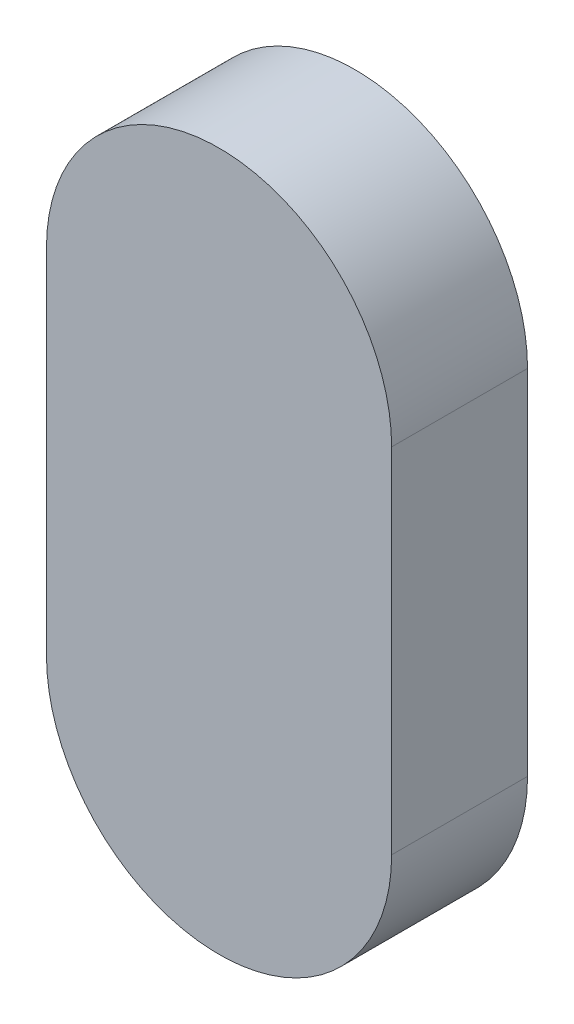
ISO-10303-21;
HEADER;
FILE_DESCRIPTION(('STEP AP214'),'2;1');
FILE_NAME('part.step','',(''),(''),'','','');
FILE_SCHEMA(('AUTOMOTIVE_DESIGN { 1 0 10303 214 1 1 1 1 }'));
ENDSEC;
DATA;
#1=APPLICATION_CONTEXT('core data for automotive mechanical design processes');
#2=APPLICATION_PROTOCOL_DEFINITION('international standard','automotive_design',2000,#1);
#3=PRODUCT_CONTEXT('',#1,'mechanical');
#4=PRODUCT('Part','Part','',(#3));
#5=PRODUCT_RELATED_PRODUCT_CATEGORY('part','',(#4));
#6=PRODUCT_DEFINITION_FORMATION('','',#4);
#7=PRODUCT_DEFINITION_CONTEXT('part definition',#1,'design');
#8=PRODUCT_DEFINITION('design','',#6,#7);
#9=PRODUCT_DEFINITION_SHAPE('','',#8);
#10=(LENGTH_UNIT() NAMED_UNIT(*) SI_UNIT(.MILLI.,.METRE.));
#11=(NAMED_UNIT(*) PLANE_ANGLE_UNIT() SI_UNIT($,.RADIAN.));
#12=(NAMED_UNIT(*) SI_UNIT($,.STERADIAN.) SOLID_ANGLE_UNIT());
#13=UNCERTAINTY_MEASURE_WITH_UNIT(LENGTH_MEASURE(1.E-05),#10,'distance_accuracy_value','');
#14=(GEOMETRIC_REPRESENTATION_CONTEXT(3) GLOBAL_UNCERTAINTY_ASSIGNED_CONTEXT((#13)) GLOBAL_UNIT_ASSIGNED_CONTEXT((#10,
#11,#12)) REPRESENTATION_CONTEXT('',''));
#15=CARTESIAN_POINT('',(0.,0.,0.));
#16=DIRECTION('',(0.,0.,1.));
#17=DIRECTION('',(1.,0.,0.));
#18=AXIS2_PLACEMENT_3D('',#15,#16,#17);
#19=CARTESIAN_POINT('',(91.2689564,67.8501056,0.));
#20=DIRECTION('',(-1.,0.,0.));
#21=DIRECTION('',(0.,1.,0.));
#22=AXIS2_PLACEMENT_3D('',#19,#20,#21);
#23=PLANE('',#22);
#24=DIRECTION('',(0.,1.,0.));
#25=VECTOR('',#24,1.);
#26=CARTESIAN_POINT('',(91.2689564,67.8501056,0.1999996));
#27=LINE('',#26,#25);
#28=CARTESIAN_POINT('',(91.2689564,67.8501056,0.1999996));
#29=VERTEX_POINT('',#28);
#30=CARTESIAN_POINT('',(91.2689564,68.3700436,0.1999996));
#31=VERTEX_POINT('',#30);
#32=EDGE_CURVE('E11',#29,#31,#27,.T.);
#33=ORIENTED_EDGE('',*,*,#32,.F.);
#34=DIRECTION('',(0.,0.,1.));
#35=VECTOR('',#34,1.);
#36=CARTESIAN_POINT('',(91.2689564,67.8501056,0.));
#37=LINE('',#36,#35);
#38=CARTESIAN_POINT('',(91.2689564,67.8501056,0.));
#39=VERTEX_POINT('',#38);
#40=EDGE_CURVE('E24',#39,#29,#37,.T.);
#41=ORIENTED_EDGE('',*,*,#40,.F.);
#42=DIRECTION('',(0.,1.,0.));
#43=VECTOR('',#42,1.);
#44=CARTESIAN_POINT('',(91.2689564,67.8501056,0.));
#45=LINE('',#44,#43);
#46=CARTESIAN_POINT('',(91.2689564,68.3700436,0.));
#47=VERTEX_POINT('',#46);
#48=EDGE_CURVE('E75',#39,#47,#45,.T.);
#49=ORIENTED_EDGE('',*,*,#48,.T.);
#50=DIRECTION('',(0.,0.,1.));
#51=VECTOR('',#50,1.);
#52=CARTESIAN_POINT('',(91.2689564,68.3700436,0.));
#53=LINE('',#52,#51);
#54=EDGE_CURVE('E37',#47,#31,#53,.T.);
#55=ORIENTED_EDGE('',*,*,#54,.T.);
#56=EDGE_LOOP('',(#33,#41,#49,#55));
#57=FACE_BOUND('',#56,.T.);
#58=ADVANCED_FACE('F17',(#57),#23,.F.);
#59=CARTESIAN_POINT('',(91.0149564,68.3700436,0.));
#60=DIRECTION('',(0.,0.,-1.));
#61=DIRECTION('',(1.,0.,0.));
#62=AXIS2_PLACEMENT_3D('',#59,#60,#61);
#63=CYLINDRICAL_SURFACE('',#62,0.254000000000005);
#64=CARTESIAN_POINT('',(91.0149564,68.3700436,0.1999996));
#65=DIRECTION('',(0.,0.,1.));
#66=DIRECTION('',(1.,0.,0.));
#67=AXIS2_PLACEMENT_3D('',#64,#65,#66);
#68=CIRCLE('',#67,0.254000000000005);
#69=CARTESIAN_POINT('',(90.7609564,68.3700436,0.1999996));
#70=VERTEX_POINT('',#69);
#71=EDGE_CURVE('E83',#31,#70,#68,.T.);
#72=ORIENTED_EDGE('',*,*,#71,.F.);
#73=ORIENTED_EDGE('',*,*,#54,.F.);
#74=CARTESIAN_POINT('',(91.0149564,68.3700436,0.));
#75=DIRECTION('',(0.,0.,1.));
#76=DIRECTION('',(1.,0.,0.));
#77=AXIS2_PLACEMENT_3D('',#74,#75,#76);
#78=CIRCLE('',#77,0.254000000000005);
#79=CARTESIAN_POINT('',(90.7609564,68.3700436,0.));
#80=VERTEX_POINT('',#79);
#81=EDGE_CURVE('E81',#47,#80,#78,.T.);
#82=ORIENTED_EDGE('',*,*,#81,.T.);
#83=DIRECTION('',(0.,0.,1.));
#84=VECTOR('',#83,1.);
#85=CARTESIAN_POINT('',(90.7609564,68.3700436,0.));
#86=LINE('',#85,#84);
#87=EDGE_CURVE('E67',#80,#70,#86,.T.);
#88=ORIENTED_EDGE('',*,*,#87,.T.);
#89=EDGE_LOOP('',(#72,#73,#82,#88));
#90=FACE_BOUND('',#89,.T.);
#91=ADVANCED_FACE('F89',(#90),#63,.T.);
#92=CARTESIAN_POINT('',(90.7609564,68.3700436,0.));
#93=DIRECTION('',(1.,0.,0.));
#94=DIRECTION('',(0.,-1.,0.));
#95=AXIS2_PLACEMENT_3D('',#92,#93,#94);
#96=PLANE('',#95);
#97=DIRECTION('',(0.,-1.,0.));
#98=VECTOR('',#97,1.);
#99=CARTESIAN_POINT('',(90.7609564,68.3700436,0.1999996));
#100=LINE('',#99,#98);
#101=CARTESIAN_POINT('',(90.7609564,67.8501056,0.1999996));
#102=VERTEX_POINT('',#101);
#103=EDGE_CURVE('E71',#70,#102,#100,.T.);
#104=ORIENTED_EDGE('',*,*,#103,.F.);
#105=ORIENTED_EDGE('',*,*,#87,.F.);
#106=DIRECTION('',(0.,-1.,0.));
#107=VECTOR('',#106,1.);
#108=CARTESIAN_POINT('',(90.7609564,68.3700436,0.));
#109=LINE('',#108,#107);
#110=CARTESIAN_POINT('',(90.7609564,67.8501056,0.));
#111=VERTEX_POINT('',#110);
#112=EDGE_CURVE('E63',#80,#111,#109,.T.);
#113=ORIENTED_EDGE('',*,*,#112,.T.);
#114=DIRECTION('',(0.,0.,1.));
#115=VECTOR('',#114,1.);
#116=CARTESIAN_POINT('',(90.7609564,67.8501056,0.));
#117=LINE('',#116,#115);
#118=EDGE_CURVE('E53',#111,#102,#117,.T.);
#119=ORIENTED_EDGE('',*,*,#118,.T.);
#120=EDGE_LOOP('',(#104,#105,#113,#119));
#121=FACE_BOUND('',#120,.T.);
#122=ADVANCED_FACE('F66',(#121),#96,.F.);
#123=CARTESIAN_POINT('',(91.0149564,67.8501056,0.));
#124=DIRECTION('',(0.,0.,-1.));
#125=DIRECTION('',(-1.,0.,0.));
#126=AXIS2_PLACEMENT_3D('',#123,#124,#125);
#127=CYLINDRICAL_SURFACE('',#126,0.254000000000005);
#128=CARTESIAN_POINT('',(91.0149564,67.8501056,0.1999996));
#129=DIRECTION('',(0.,0.,1.));
#130=DIRECTION('',(-1.,0.,0.));
#131=AXIS2_PLACEMENT_3D('',#128,#129,#130);
#132=CIRCLE('',#131,0.254000000000005);
#133=EDGE_CURVE('E59',#102,#29,#132,.T.);
#134=ORIENTED_EDGE('',*,*,#133,.F.);
#135=ORIENTED_EDGE('',*,*,#118,.F.);
#136=CARTESIAN_POINT('',(91.0149564,67.8501056,0.));
#137=DIRECTION('',(0.,0.,1.));
#138=DIRECTION('',(-1.,0.,0.));
#139=AXIS2_PLACEMENT_3D('',#136,#137,#138);
#140=CIRCLE('',#139,0.254000000000005);
#141=EDGE_CURVE('E57',#111,#39,#140,.T.);
#142=ORIENTED_EDGE('',*,*,#141,.T.);
#143=ORIENTED_EDGE('',*,*,#40,.T.);
#144=EDGE_LOOP('',(#134,#135,#142,#143));
#145=FACE_BOUND('',#144,.T.);
#146=ADVANCED_FACE('F55',(#145),#127,.T.);
#147=CARTESIAN_POINT('',(91.2689564,67.8501056,0.));
#148=DIRECTION('',(0.,0.,-1.));
#149=DIRECTION('',(-1.,0.,0.));
#150=AXIS2_PLACEMENT_3D('',#147,#148,#149);
#151=PLANE('',#150);
#152=ORIENTED_EDGE('',*,*,#141,.F.);
#153=ORIENTED_EDGE('',*,*,#112,.F.);
#154=ORIENTED_EDGE('',*,*,#81,.F.);
#155=ORIENTED_EDGE('',*,*,#48,.F.);
#156=EDGE_LOOP('',(#152,#153,#154,#155));
#157=FACE_BOUND('',#156,.T.);
#158=ADVANCED_FACE('F74',(#157),#151,.T.);
#159=CARTESIAN_POINT('',(91.2689564,67.8501056,0.1999996));
#160=DIRECTION('',(0.,0.,-1.));
#161=DIRECTION('',(-1.,0.,0.));
#162=AXIS2_PLACEMENT_3D('',#159,#160,#161);
#163=PLANE('',#162);
#164=ORIENTED_EDGE('',*,*,#32,.T.);
#165=ORIENTED_EDGE('',*,*,#71,.T.);
#166=ORIENTED_EDGE('',*,*,#103,.T.);
#167=ORIENTED_EDGE('',*,*,#133,.T.);
#168=EDGE_LOOP('',(#164,#165,#166,#167));
#169=FACE_BOUND('',#168,.T.);
#170=ADVANCED_FACE('F91',(#169),#163,.F.);
#171=CLOSED_SHELL('',(#58,#91,#122,#146,#158,#170));
#172=MANIFOLD_SOLID_BREP('B1',#171);
#173=ADVANCED_BREP_SHAPE_REPRESENTATION('',(#18,#172),#14);
#174=SHAPE_DEFINITION_REPRESENTATION(#9,#173);
ENDSEC;
END-ISO-10303-21;
